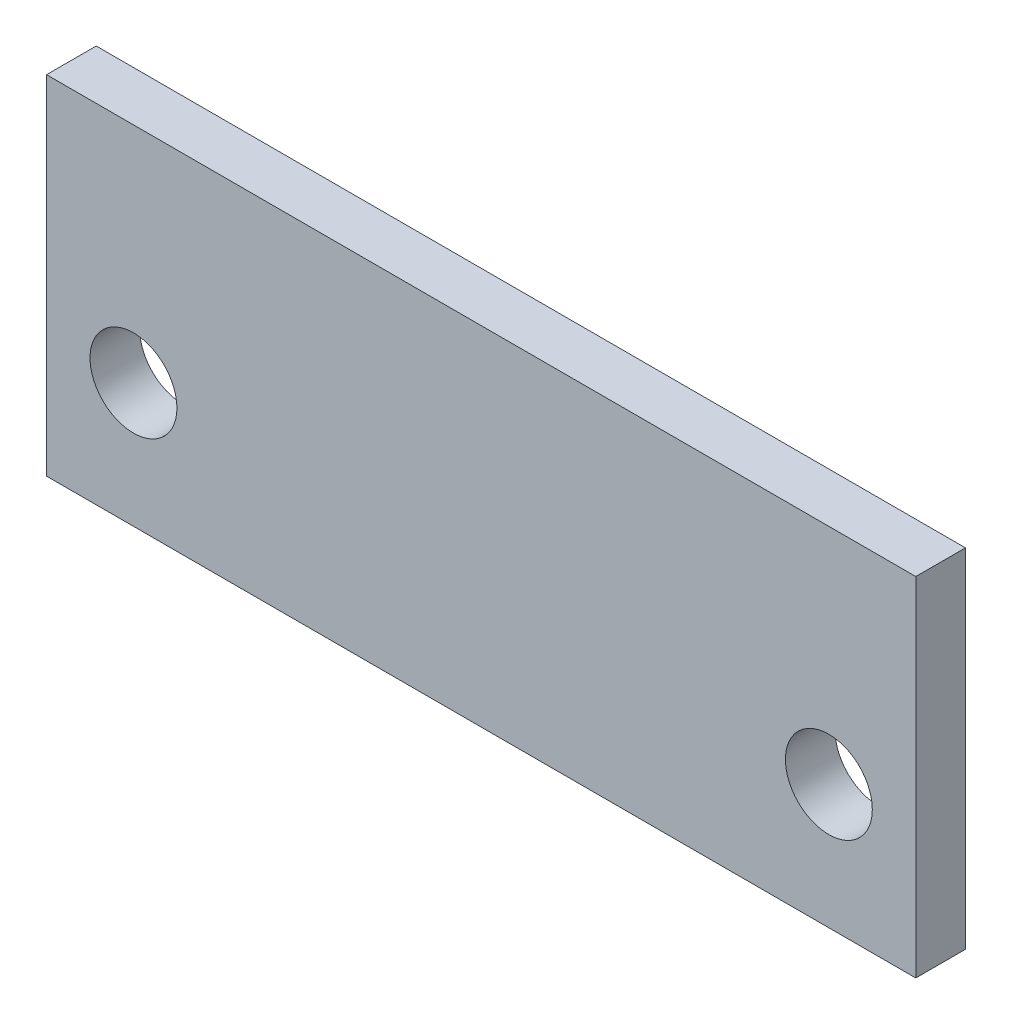
ISO-10303-21;
HEADER;
FILE_DESCRIPTION(('STEP AP214'),'2;1');
FILE_NAME('part.step','',(''),(''),'','','');
FILE_SCHEMA(('AUTOMOTIVE_DESIGN { 1 0 10303 214 1 1 1 1 }'));
ENDSEC;
DATA;
#1=APPLICATION_CONTEXT('core data for automotive mechanical design processes');
#2=APPLICATION_PROTOCOL_DEFINITION('international standard','automotive_design',2000,#1);
#3=PRODUCT_CONTEXT('',#1,'mechanical');
#4=PRODUCT('Part','Part','',(#3));
#5=PRODUCT_RELATED_PRODUCT_CATEGORY('part','',(#4));
#6=PRODUCT_DEFINITION_FORMATION('','',#4);
#7=PRODUCT_DEFINITION_CONTEXT('part definition',#1,'design');
#8=PRODUCT_DEFINITION('design','',#6,#7);
#9=PRODUCT_DEFINITION_SHAPE('','',#8);
#10=(LENGTH_UNIT() NAMED_UNIT(*) SI_UNIT(.MILLI.,.METRE.));
#11=(NAMED_UNIT(*) PLANE_ANGLE_UNIT() SI_UNIT($,.RADIAN.));
#12=(NAMED_UNIT(*) SI_UNIT($,.STERADIAN.) SOLID_ANGLE_UNIT());
#13=UNCERTAINTY_MEASURE_WITH_UNIT(LENGTH_MEASURE(1.E-05),#10,'distance_accuracy_value','');
#14=(GEOMETRIC_REPRESENTATION_CONTEXT(3) GLOBAL_UNCERTAINTY_ASSIGNED_CONTEXT((#13)) GLOBAL_UNIT_ASSIGNED_CONTEXT((#10,
#11,#12)) REPRESENTATION_CONTEXT('',''));
#15=CARTESIAN_POINT('',(0.,0.,0.));
#16=DIRECTION('',(0.,0.,1.));
#17=DIRECTION('',(1.,0.,0.));
#18=AXIS2_PLACEMENT_3D('',#15,#16,#17);
#19=CARTESIAN_POINT('',(17.5,14.,1.));
#20=DIRECTION('',(-1.,0.,0.));
#21=DIRECTION('',(0.,0.,1.));
#22=AXIS2_PLACEMENT_3D('',#19,#20,#21);
#23=PLANE('',#22);
#24=DIRECTION('',(0.,0.,-1.));
#25=VECTOR('',#24,1.);
#26=CARTESIAN_POINT('',(17.5,0.,1.));
#27=LINE('',#26,#25);
#28=CARTESIAN_POINT('',(17.5,0.,1.));
#29=VERTEX_POINT('',#28);
#30=CARTESIAN_POINT('',(17.5,0.,-1.));
#31=VERTEX_POINT('',#30);
#32=EDGE_CURVE('E98',#29,#31,#27,.T.);
#33=ORIENTED_EDGE('',*,*,#32,.T.);
#34=DIRECTION('',(0.,-1.,0.));
#35=VECTOR('',#34,1.);
#36=CARTESIAN_POINT('',(17.5,14.,-1.));
#37=LINE('',#36,#35);
#38=CARTESIAN_POINT('',(17.5,14.,-1.));
#39=VERTEX_POINT('',#38);
#40=EDGE_CURVE('E11',#39,#31,#37,.T.);
#41=ORIENTED_EDGE('',*,*,#40,.F.);
#42=DIRECTION('',(0.,0.,-1.));
#43=VECTOR('',#42,1.);
#44=CARTESIAN_POINT('',(17.5,14.,1.));
#45=LINE('',#44,#43);
#46=CARTESIAN_POINT('',(17.5,14.,1.));
#47=VERTEX_POINT('',#46);
#48=EDGE_CURVE('E86',#47,#39,#45,.T.);
#49=ORIENTED_EDGE('',*,*,#48,.F.);
#50=DIRECTION('',(0.,-1.,0.));
#51=VECTOR('',#50,1.);
#52=CARTESIAN_POINT('',(17.5,14.,1.));
#53=LINE('',#52,#51);
#54=EDGE_CURVE('E94',#47,#29,#53,.T.);
#55=ORIENTED_EDGE('',*,*,#54,.T.);
#56=EDGE_LOOP('',(#33,#41,#49,#55));
#57=FACE_BOUND('',#56,.T.);
#58=ADVANCED_FACE('F35',(#57),#23,.F.);
#59=CARTESIAN_POINT('',(-17.5,14.,-1.));
#60=DIRECTION('',(0.,0.,1.));
#61=DIRECTION('',(1.,0.,0.));
#62=AXIS2_PLACEMENT_3D('',#59,#60,#61);
#63=PLANE('',#62);
#64=CARTESIAN_POINT('',(-14.,5.,-1.));
#65=DIRECTION('',(0.,0.,1.));
#66=DIRECTION('',(1.,0.,0.));
#67=AXIS2_PLACEMENT_3D('',#64,#65,#66);
#68=CIRCLE('',#67,1.75);
#69=CARTESIAN_POINT('',(-12.25,5.,-1.));
#70=VERTEX_POINT('',#69);
#71=EDGE_CURVE('E101',#70,#70,#68,.T.);
#72=ORIENTED_EDGE('',*,*,#71,.T.);
#73=EDGE_LOOP('',(#72));
#74=FACE_BOUND('',#73,.T.);
#75=CARTESIAN_POINT('',(14.,5.,-1.));
#76=DIRECTION('',(0.,0.,1.));
#77=DIRECTION('',(1.,0.,0.));
#78=AXIS2_PLACEMENT_3D('',#75,#76,#77);
#79=CIRCLE('',#78,1.75);
#80=CARTESIAN_POINT('',(15.75,5.,-1.));
#81=VERTEX_POINT('',#80);
#82=EDGE_CURVE('E114',#81,#81,#79,.T.);
#83=ORIENTED_EDGE('',*,*,#82,.T.);
#84=EDGE_LOOP('',(#83));
#85=FACE_BOUND('',#84,.T.);
#86=DIRECTION('',(-1.,0.,0.));
#87=VECTOR('',#86,1.);
#88=CARTESIAN_POINT('',(-17.5,0.,-1.));
#89=LINE('',#88,#87);
#90=CARTESIAN_POINT('',(-17.5,0.,-1.));
#91=VERTEX_POINT('',#90);
#92=EDGE_CURVE('E90',#31,#91,#89,.T.);
#93=ORIENTED_EDGE('',*,*,#92,.T.);
#94=DIRECTION('',(0.,-1.,0.));
#95=VECTOR('',#94,1.);
#96=CARTESIAN_POINT('',(-17.5,14.,-1.));
#97=LINE('',#96,#95);
#98=CARTESIAN_POINT('',(-17.5,14.,-1.));
#99=VERTEX_POINT('',#98);
#100=EDGE_CURVE('E43',#99,#91,#97,.T.);
#101=ORIENTED_EDGE('',*,*,#100,.F.);
#102=DIRECTION('',(-1.,0.,0.));
#103=VECTOR('',#102,1.);
#104=CARTESIAN_POINT('',(-17.5,14.,-1.));
#105=LINE('',#104,#103);
#106=EDGE_CURVE('E81',#39,#99,#105,.T.);
#107=ORIENTED_EDGE('',*,*,#106,.F.);
#108=ORIENTED_EDGE('',*,*,#40,.T.);
#109=EDGE_LOOP('',(#93,#101,#107,#108));
#110=FACE_BOUND('',#109,.T.);
#111=ADVANCED_FACE('F89',(#74,#85,#110),#63,.F.);
#112=CARTESIAN_POINT('',(-17.5,14.,1.));
#113=DIRECTION('',(1.,0.,0.));
#114=DIRECTION('',(0.,0.,-1.));
#115=AXIS2_PLACEMENT_3D('',#112,#113,#114);
#116=PLANE('',#115);
#117=DIRECTION('',(0.,0.,1.));
#118=VECTOR('',#117,1.);
#119=CARTESIAN_POINT('',(-17.5,0.,1.));
#120=LINE('',#119,#118);
#121=CARTESIAN_POINT('',(-17.5,0.,1.));
#122=VERTEX_POINT('',#121);
#123=EDGE_CURVE('E68',#91,#122,#120,.T.);
#124=ORIENTED_EDGE('',*,*,#123,.T.);
#125=DIRECTION('',(0.,-1.,0.));
#126=VECTOR('',#125,1.);
#127=CARTESIAN_POINT('',(-17.5,14.,1.));
#128=LINE('',#127,#126);
#129=CARTESIAN_POINT('',(-17.5,14.,1.));
#130=VERTEX_POINT('',#129);
#131=EDGE_CURVE('E91',#130,#122,#128,.T.);
#132=ORIENTED_EDGE('',*,*,#131,.F.);
#133=DIRECTION('',(0.,0.,1.));
#134=VECTOR('',#133,1.);
#135=CARTESIAN_POINT('',(-17.5,14.,1.));
#136=LINE('',#135,#134);
#137=EDGE_CURVE('E84',#99,#130,#136,.T.);
#138=ORIENTED_EDGE('',*,*,#137,.F.);
#139=ORIENTED_EDGE('',*,*,#100,.T.);
#140=EDGE_LOOP('',(#124,#132,#138,#139));
#141=FACE_BOUND('',#140,.T.);
#142=ADVANCED_FACE('F92',(#141),#116,.F.);
#143=CARTESIAN_POINT('',(-17.5,14.,1.));
#144=DIRECTION('',(0.,0.,-1.));
#145=DIRECTION('',(-1.,0.,0.));
#146=AXIS2_PLACEMENT_3D('',#143,#144,#145);
#147=PLANE('',#146);
#148=CARTESIAN_POINT('',(-14.,5.,1.));
#149=DIRECTION('',(0.,0.,1.));
#150=DIRECTION('',(1.,0.,0.));
#151=AXIS2_PLACEMENT_3D('',#148,#149,#150);
#152=CIRCLE('',#151,1.75);
#153=CARTESIAN_POINT('',(-12.25,5.,1.));
#154=VERTEX_POINT('',#153);
#155=EDGE_CURVE('E117',#154,#154,#152,.T.);
#156=ORIENTED_EDGE('',*,*,#155,.F.);
#157=EDGE_LOOP('',(#156));
#158=FACE_BOUND('',#157,.T.);
#159=CARTESIAN_POINT('',(14.,5.,1.));
#160=DIRECTION('',(0.,0.,1.));
#161=DIRECTION('',(1.,0.,0.));
#162=AXIS2_PLACEMENT_3D('',#159,#160,#161);
#163=CIRCLE('',#162,1.75);
#164=CARTESIAN_POINT('',(15.75,5.,1.));
#165=VERTEX_POINT('',#164);
#166=EDGE_CURVE('E118',#165,#165,#163,.T.);
#167=ORIENTED_EDGE('',*,*,#166,.F.);
#168=EDGE_LOOP('',(#167));
#169=FACE_BOUND('',#168,.T.);
#170=DIRECTION('',(1.,0.,0.));
#171=VECTOR('',#170,1.);
#172=CARTESIAN_POINT('',(-17.5,0.,1.));
#173=LINE('',#172,#171);
#174=EDGE_CURVE('E74',#122,#29,#173,.T.);
#175=ORIENTED_EDGE('',*,*,#174,.T.);
#176=ORIENTED_EDGE('',*,*,#54,.F.);
#177=DIRECTION('',(1.,0.,0.));
#178=VECTOR('',#177,1.);
#179=CARTESIAN_POINT('',(-17.5,14.,1.));
#180=LINE('',#179,#178);
#181=EDGE_CURVE('E51',#130,#47,#180,.T.);
#182=ORIENTED_EDGE('',*,*,#181,.F.);
#183=ORIENTED_EDGE('',*,*,#131,.T.);
#184=EDGE_LOOP('',(#175,#176,#182,#183));
#185=FACE_BOUND('',#184,.T.);
#186=ADVANCED_FACE('F106',(#158,#169,#185),#147,.F.);
#187=CARTESIAN_POINT('',(0.,14.,0.));
#188=DIRECTION('',(0.,-1.,0.));
#189=DIRECTION('',(0.,0.,-1.));
#190=AXIS2_PLACEMENT_3D('',#187,#188,#189);
#191=PLANE('',#190);
#192=ORIENTED_EDGE('',*,*,#48,.T.);
#193=ORIENTED_EDGE('',*,*,#106,.T.);
#194=ORIENTED_EDGE('',*,*,#137,.T.);
#195=ORIENTED_EDGE('',*,*,#181,.T.);
#196=EDGE_LOOP('',(#192,#193,#194,#195));
#197=FACE_BOUND('',#196,.T.);
#198=ADVANCED_FACE('F82',(#197),#191,.F.);
#199=CARTESIAN_POINT('',(0.,0.,0.));
#200=DIRECTION('',(0.,-1.,0.));
#201=DIRECTION('',(0.,0.,-1.));
#202=AXIS2_PLACEMENT_3D('',#199,#200,#201);
#203=PLANE('',#202);
#204=ORIENTED_EDGE('',*,*,#32,.F.);
#205=ORIENTED_EDGE('',*,*,#174,.F.);
#206=ORIENTED_EDGE('',*,*,#123,.F.);
#207=ORIENTED_EDGE('',*,*,#92,.F.);
#208=EDGE_LOOP('',(#204,#205,#206,#207));
#209=FACE_BOUND('',#208,.T.);
#210=ADVANCED_FACE('F109',(#209),#203,.T.);
#211=CARTESIAN_POINT('',(14.,5.,-13.));
#212=DIRECTION('',(0.,0.,1.));
#213=DIRECTION('',(1.,0.,0.));
#214=AXIS2_PLACEMENT_3D('',#211,#212,#213);
#215=CYLINDRICAL_SURFACE('',#214,1.75);
#216=ORIENTED_EDGE('',*,*,#166,.T.);
#217=EDGE_LOOP('',(#216));
#218=FACE_BOUND('',#217,.T.);
#219=ORIENTED_EDGE('',*,*,#82,.F.);
#220=EDGE_LOOP('',(#219));
#221=FACE_BOUND('',#220,.T.);
#222=ADVANCED_FACE('F132',(#218,#221),#215,.F.);
#223=CARTESIAN_POINT('',(-14.,5.,-13.));
#224=DIRECTION('',(0.,0.,1.));
#225=DIRECTION('',(1.,0.,0.));
#226=AXIS2_PLACEMENT_3D('',#223,#224,#225);
#227=CYLINDRICAL_SURFACE('',#226,1.75);
#228=ORIENTED_EDGE('',*,*,#155,.T.);
#229=EDGE_LOOP('',(#228));
#230=FACE_BOUND('',#229,.T.);
#231=ORIENTED_EDGE('',*,*,#71,.F.);
#232=EDGE_LOOP('',(#231));
#233=FACE_BOUND('',#232,.T.);
#234=ADVANCED_FACE('F124',(#230,#233),#227,.F.);
#235=CLOSED_SHELL('',(#58,#111,#142,#186,#198,#210,#222,#234));
#236=MANIFOLD_SOLID_BREP('B2',#235);
#237=ADVANCED_BREP_SHAPE_REPRESENTATION('',(#18,#236),#14);
#238=SHAPE_DEFINITION_REPRESENTATION(#9,#237);
ENDSEC;
END-ISO-10303-21;
